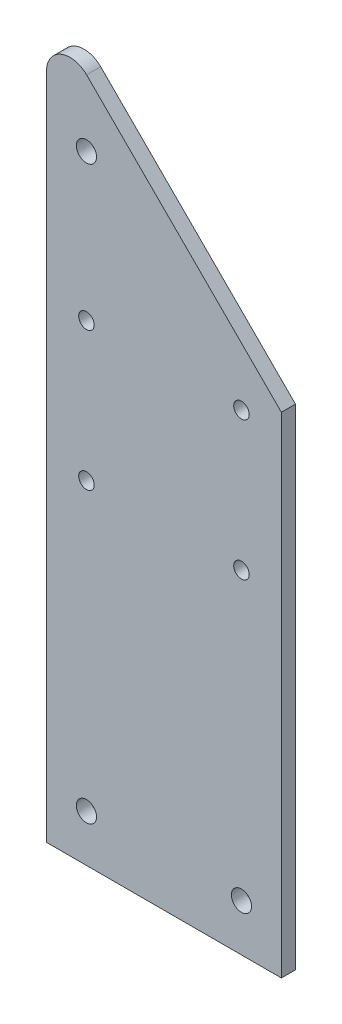
ISO-10303-21;
HEADER;
FILE_DESCRIPTION(('STEP AP214'),'2;1');
FILE_NAME('part.step','',(''),(''),'','','');
FILE_SCHEMA(('AUTOMOTIVE_DESIGN { 1 0 10303 214 1 1 1 1 }'));
ENDSEC;
DATA;
#1=APPLICATION_CONTEXT('core data for automotive mechanical design processes');
#2=APPLICATION_PROTOCOL_DEFINITION('international standard','automotive_design',2000,#1);
#3=PRODUCT_CONTEXT('',#1,'mechanical');
#4=PRODUCT('Part','Part','',(#3));
#5=PRODUCT_RELATED_PRODUCT_CATEGORY('part','',(#4));
#6=PRODUCT_DEFINITION_FORMATION('','',#4);
#7=PRODUCT_DEFINITION_CONTEXT('part definition',#1,'design');
#8=PRODUCT_DEFINITION('design','',#6,#7);
#9=PRODUCT_DEFINITION_SHAPE('','',#8);
#10=(LENGTH_UNIT() NAMED_UNIT(*) SI_UNIT(.MILLI.,.METRE.));
#11=(NAMED_UNIT(*) PLANE_ANGLE_UNIT() SI_UNIT($,.RADIAN.));
#12=(NAMED_UNIT(*) SI_UNIT($,.STERADIAN.) SOLID_ANGLE_UNIT());
#13=UNCERTAINTY_MEASURE_WITH_UNIT(LENGTH_MEASURE(1.E-05),#10,'distance_accuracy_value','');
#14=(GEOMETRIC_REPRESENTATION_CONTEXT(3) GLOBAL_UNCERTAINTY_ASSIGNED_CONTEXT((#13)) GLOBAL_UNIT_ASSIGNED_CONTEXT((#10,
#11,#12)) REPRESENTATION_CONTEXT('',''));
#15=CARTESIAN_POINT('',(0.,0.,0.));
#16=DIRECTION('',(0.,0.,1.));
#17=DIRECTION('',(1.,0.,0.));
#18=AXIS2_PLACEMENT_3D('',#15,#16,#17);
#19=CARTESIAN_POINT('',(50.,0.,3.));
#20=DIRECTION('',(0.,1.,0.));
#21=DIRECTION('',(-1.,0.,0.));
#22=AXIS2_PLACEMENT_3D('',#19,#20,#21);
#23=PLANE('',#22);
#24=DIRECTION('',(1.,0.,0.));
#25=VECTOR('',#24,1.);
#26=CARTESIAN_POINT('',(50.,0.,0.));
#27=LINE('',#26,#25);
#28=CARTESIAN_POINT('',(0.,0.,0.));
#29=VERTEX_POINT('',#28);
#30=CARTESIAN_POINT('',(50.,0.,0.));
#31=VERTEX_POINT('',#30);
#32=EDGE_CURVE('E103',#29,#31,#27,.T.);
#33=ORIENTED_EDGE('',*,*,#32,.T.);
#34=DIRECTION('',(0.,0.,-1.));
#35=VECTOR('',#34,1.);
#36=CARTESIAN_POINT('',(50.,0.,3.));
#37=LINE('',#36,#35);
#38=CARTESIAN_POINT('',(50.,0.,3.));
#39=VERTEX_POINT('',#38);
#40=EDGE_CURVE('E85',#39,#31,#37,.T.);
#41=ORIENTED_EDGE('',*,*,#40,.F.);
#42=DIRECTION('',(1.,0.,0.));
#43=VECTOR('',#42,1.);
#44=CARTESIAN_POINT('',(50.,0.,3.));
#45=LINE('',#44,#43);
#46=CARTESIAN_POINT('',(0.,0.,3.));
#47=VERTEX_POINT('',#46);
#48=EDGE_CURVE('E91',#47,#39,#45,.T.);
#49=ORIENTED_EDGE('',*,*,#48,.F.);
#50=DIRECTION('',(0.,0.,-1.));
#51=VECTOR('',#50,1.);
#52=CARTESIAN_POINT('',(0.,0.,3.));
#53=LINE('',#52,#51);
#54=EDGE_CURVE('E108',#47,#29,#53,.T.);
#55=ORIENTED_EDGE('',*,*,#54,.T.);
#56=EDGE_LOOP('',(#33,#41,#49,#55));
#57=FACE_BOUND('',#56,.T.);
#58=ADVANCED_FACE('F34',(#57),#23,.F.);
#59=CARTESIAN_POINT('',(50.,104.3,3.));
#60=DIRECTION('',(-1.,0.,0.));
#61=DIRECTION('',(0.,-1.,0.));
#62=AXIS2_PLACEMENT_3D('',#59,#60,#61);
#63=PLANE('',#62);
#64=DIRECTION('',(0.,1.,0.));
#65=VECTOR('',#64,1.);
#66=CARTESIAN_POINT('',(50.,104.3,0.));
#67=LINE('',#66,#65);
#68=CARTESIAN_POINT('',(50.,104.3,0.));
#69=VERTEX_POINT('',#68);
#70=EDGE_CURVE('E116',#31,#69,#67,.T.);
#71=ORIENTED_EDGE('',*,*,#70,.T.);
#72=DIRECTION('',(0.,0.,-1.));
#73=VECTOR('',#72,1.);
#74=CARTESIAN_POINT('',(50.,104.3,3.));
#75=LINE('',#74,#73);
#76=CARTESIAN_POINT('',(50.,104.3,3.));
#77=VERTEX_POINT('',#76);
#78=EDGE_CURVE('E88',#77,#69,#75,.T.);
#79=ORIENTED_EDGE('',*,*,#78,.F.);
#80=DIRECTION('',(0.,1.,0.));
#81=VECTOR('',#80,1.);
#82=CARTESIAN_POINT('',(50.,104.3,3.));
#83=LINE('',#82,#81);
#84=EDGE_CURVE('E81',#39,#77,#83,.T.);
#85=ORIENTED_EDGE('',*,*,#84,.F.);
#86=ORIENTED_EDGE('',*,*,#40,.T.);
#87=EDGE_LOOP('',(#71,#79,#85,#86));
#88=FACE_BOUND('',#87,.T.);
#89=ADVANCED_FACE('F83',(#88),#63,.F.);
#90=CARTESIAN_POINT('',(0.,154.299999999999,3.));
#91=DIRECTION('',(-0.707106781186541,-0.707106781186554,0.));
#92=DIRECTION('',(0.707106781186554,-0.707106781186541,0.));
#93=AXIS2_PLACEMENT_3D('',#90,#91,#92);
#94=PLANE('',#93);
#95=DIRECTION('',(-0.707106781186554,0.707106781186541,0.));
#96=VECTOR('',#95,1.);
#97=CARTESIAN_POINT('',(0.,154.299999999999,0.));
#98=LINE('',#97,#96);
#99=CARTESIAN_POINT('',(8.53553390593272,145.764466094067,0.));
#100=VERTEX_POINT('',#99);
#101=EDGE_CURVE('E114',#69,#100,#98,.T.);
#102=ORIENTED_EDGE('',*,*,#101,.T.);
#103=DIRECTION('',(0.,0.,-1.));
#104=VECTOR('',#103,1.);
#105=CARTESIAN_POINT('',(8.53553390593272,145.764466094067,3.));
#106=LINE('',#105,#104);
#107=CARTESIAN_POINT('',(8.53553390593272,145.764466094067,3.));
#108=VERTEX_POINT('',#107);
#109=EDGE_CURVE('E42',#100,#108,#106,.F.);
#110=ORIENTED_EDGE('',*,*,#109,.T.);
#111=DIRECTION('',(-0.707106781186554,0.707106781186541,0.));
#112=VECTOR('',#111,1.);
#113=CARTESIAN_POINT('',(0.,154.299999999999,3.));
#114=LINE('',#113,#112);
#115=EDGE_CURVE('E90',#77,#108,#114,.T.);
#116=ORIENTED_EDGE('',*,*,#115,.F.);
#117=ORIENTED_EDGE('',*,*,#78,.T.);
#118=EDGE_LOOP('',(#102,#110,#116,#117));
#119=FACE_BOUND('',#118,.T.);
#120=ADVANCED_FACE('F202',(#119),#94,.F.);
#121=CARTESIAN_POINT('',(0.,0.,3.));
#122=DIRECTION('',(1.,0.,0.));
#123=DIRECTION('',(0.,0.,-1.));
#124=AXIS2_PLACEMENT_3D('',#121,#122,#123);
#125=PLANE('',#124);
#126=DIRECTION('',(0.,-1.,0.));
#127=VECTOR('',#126,1.);
#128=CARTESIAN_POINT('',(0.,0.,3.));
#129=LINE('',#128,#127);
#130=CARTESIAN_POINT('',(0.,142.228932188134,3.));
#131=VERTEX_POINT('',#130);
#132=EDGE_CURVE('E96',#131,#47,#129,.T.);
#133=ORIENTED_EDGE('',*,*,#132,.F.);
#134=DIRECTION('',(0.,0.,-1.));
#135=VECTOR('',#134,1.);
#136=CARTESIAN_POINT('',(0.,142.228932188134,3.));
#137=LINE('',#136,#135);
#138=CARTESIAN_POINT('',(0.,142.228932188134,0.));
#139=VERTEX_POINT('',#138);
#140=EDGE_CURVE('E104',#131,#139,#137,.T.);
#141=ORIENTED_EDGE('',*,*,#140,.T.);
#142=DIRECTION('',(0.,-1.,0.));
#143=VECTOR('',#142,1.);
#144=CARTESIAN_POINT('',(0.,0.,0.));
#145=LINE('',#144,#143);
#146=EDGE_CURVE('E100',#139,#29,#145,.T.);
#147=ORIENTED_EDGE('',*,*,#146,.T.);
#148=ORIENTED_EDGE('',*,*,#54,.F.);
#149=EDGE_LOOP('',(#133,#141,#147,#148));
#150=FACE_BOUND('',#149,.T.);
#151=ADVANCED_FACE('F177',(#150),#125,.F.);
#152=CARTESIAN_POINT('',(0.,0.,3.));
#153=DIRECTION('',(0.,0.,-1.));
#154=DIRECTION('',(-1.,0.,0.));
#155=AXIS2_PLACEMENT_3D('',#152,#153,#154);
#156=PLANE('',#155);
#157=CARTESIAN_POINT('',(8.5,70.95,3.));
#158=DIRECTION('',(0.,0.,1.));
#159=DIRECTION('',(1.,0.,0.));
#160=AXIS2_PLACEMENT_3D('',#157,#158,#159);
#161=CIRCLE('',#160,1.65);
#162=CARTESIAN_POINT('',(10.15,70.95,3.));
#163=VERTEX_POINT('',#162);
#164=EDGE_CURVE('E140',#163,#163,#161,.T.);
#165=ORIENTED_EDGE('',*,*,#164,.F.);
#166=EDGE_LOOP('',(#165));
#167=FACE_BOUND('',#166,.T.);
#168=CARTESIAN_POINT('',(8.5,100.45,3.));
#169=DIRECTION('',(0.,0.,1.));
#170=DIRECTION('',(1.,0.,0.));
#171=AXIS2_PLACEMENT_3D('',#168,#169,#170);
#172=CIRCLE('',#171,1.65);
#173=CARTESIAN_POINT('',(10.15,100.45,3.));
#174=VERTEX_POINT('',#173);
#175=EDGE_CURVE('E147',#174,#174,#172,.T.);
#176=ORIENTED_EDGE('',*,*,#175,.F.);
#177=EDGE_LOOP('',(#176));
#178=FACE_BOUND('',#177,.T.);
#179=CARTESIAN_POINT('',(8.5,131.657864376269,3.));
#180=DIRECTION('',(0.,0.,1.));
#181=DIRECTION('',(1.,0.,0.));
#182=AXIS2_PLACEMENT_3D('',#179,#180,#181);
#183=CIRCLE('',#182,2.15000000000002);
#184=CARTESIAN_POINT('',(10.65,131.657864376269,3.));
#185=VERTEX_POINT('',#184);
#186=EDGE_CURVE('E128',#185,#185,#183,.T.);
#187=ORIENTED_EDGE('',*,*,#186,.F.);
#188=EDGE_LOOP('',(#187));
#189=FACE_BOUND('',#188,.T.);
#190=CARTESIAN_POINT('',(41.5,10.,3.));
#191=DIRECTION('',(0.,0.,1.));
#192=DIRECTION('',(1.,0.,0.));
#193=AXIS2_PLACEMENT_3D('',#190,#191,#192);
#194=CIRCLE('',#193,2.15);
#195=CARTESIAN_POINT('',(43.65,10.,3.));
#196=VERTEX_POINT('',#195);
#197=EDGE_CURVE('E135',#196,#196,#194,.T.);
#198=ORIENTED_EDGE('',*,*,#197,.F.);
#199=EDGE_LOOP('',(#198));
#200=FACE_BOUND('',#199,.T.);
#201=CARTESIAN_POINT('',(41.5,70.95,3.));
#202=DIRECTION('',(0.,0.,1.));
#203=DIRECTION('',(1.,0.,0.));
#204=AXIS2_PLACEMENT_3D('',#201,#202,#203);
#205=CIRCLE('',#204,1.65);
#206=CARTESIAN_POINT('',(43.15,70.95,3.));
#207=VERTEX_POINT('',#206);
#208=EDGE_CURVE('E158',#207,#207,#205,.T.);
#209=ORIENTED_EDGE('',*,*,#208,.F.);
#210=EDGE_LOOP('',(#209));
#211=FACE_BOUND('',#210,.T.);
#212=CARTESIAN_POINT('',(41.5,100.45,3.));
#213=DIRECTION('',(0.,0.,1.));
#214=DIRECTION('',(1.,0.,0.));
#215=AXIS2_PLACEMENT_3D('',#212,#213,#214);
#216=CIRCLE('',#215,1.65);
#217=CARTESIAN_POINT('',(43.15,100.45,3.));
#218=VERTEX_POINT('',#217);
#219=EDGE_CURVE('E152',#218,#218,#216,.T.);
#220=ORIENTED_EDGE('',*,*,#219,.F.);
#221=EDGE_LOOP('',(#220));
#222=FACE_BOUND('',#221,.T.);
#223=CARTESIAN_POINT('',(8.5,10.,3.));
#224=DIRECTION('',(0.,0.,1.));
#225=DIRECTION('',(1.,0.,0.));
#226=AXIS2_PLACEMENT_3D('',#223,#224,#225);
#227=CIRCLE('',#226,2.15);
#228=CARTESIAN_POINT('',(10.65,10.,3.));
#229=VERTEX_POINT('',#228);
#230=EDGE_CURVE('E122',#229,#229,#227,.T.);
#231=ORIENTED_EDGE('',*,*,#230,.F.);
#232=EDGE_LOOP('',(#231));
#233=FACE_BOUND('',#232,.T.);
#234=ORIENTED_EDGE('',*,*,#115,.T.);
#235=CARTESIAN_POINT('',(5.,142.228932188134,3.));
#236=DIRECTION('',(0.,0.,-1.));
#237=DIRECTION('',(-1.,0.,0.));
#238=AXIS2_PLACEMENT_3D('',#235,#236,#237);
#239=CIRCLE('',#238,5.);
#240=EDGE_CURVE('E11',#108,#131,#239,.F.);
#241=ORIENTED_EDGE('',*,*,#240,.T.);
#242=ORIENTED_EDGE('',*,*,#132,.T.);
#243=ORIENTED_EDGE('',*,*,#48,.T.);
#244=ORIENTED_EDGE('',*,*,#84,.T.);
#245=EDGE_LOOP('',(#234,#241,#242,#243,#244));
#246=FACE_BOUND('',#245,.T.);
#247=ADVANCED_FACE('F94',(#167,#178,#189,#200,#211,#222,#233,#246),#156,.F.);
#248=CARTESIAN_POINT('',(0.,0.,0.));
#249=DIRECTION('',(0.,0.,-1.));
#250=DIRECTION('',(-1.,0.,0.));
#251=AXIS2_PLACEMENT_3D('',#248,#249,#250);
#252=PLANE('',#251);
#253=CARTESIAN_POINT('',(8.5,70.95,0.));
#254=DIRECTION('',(0.,0.,1.));
#255=DIRECTION('',(1.,0.,0.));
#256=AXIS2_PLACEMENT_3D('',#253,#254,#255);
#257=CIRCLE('',#256,1.65);
#258=CARTESIAN_POINT('',(10.15,70.95,0.));
#259=VERTEX_POINT('',#258);
#260=EDGE_CURVE('E143',#259,#259,#257,.T.);
#261=ORIENTED_EDGE('',*,*,#260,.T.);
#262=EDGE_LOOP('',(#261));
#263=FACE_BOUND('',#262,.T.);
#264=CARTESIAN_POINT('',(8.5,100.45,0.));
#265=DIRECTION('',(0.,0.,1.));
#266=DIRECTION('',(1.,0.,0.));
#267=AXIS2_PLACEMENT_3D('',#264,#265,#266);
#268=CIRCLE('',#267,1.65);
#269=CARTESIAN_POINT('',(10.15,100.45,0.));
#270=VERTEX_POINT('',#269);
#271=EDGE_CURVE('E132',#270,#270,#268,.T.);
#272=ORIENTED_EDGE('',*,*,#271,.T.);
#273=EDGE_LOOP('',(#272));
#274=FACE_BOUND('',#273,.T.);
#275=CARTESIAN_POINT('',(8.5,131.657864376269,0.));
#276=DIRECTION('',(0.,0.,1.));
#277=DIRECTION('',(1.,0.,0.));
#278=AXIS2_PLACEMENT_3D('',#275,#276,#277);
#279=CIRCLE('',#278,2.15000000000002);
#280=CARTESIAN_POINT('',(10.65,131.657864376269,0.));
#281=VERTEX_POINT('',#280);
#282=EDGE_CURVE('E131',#281,#281,#279,.T.);
#283=ORIENTED_EDGE('',*,*,#282,.T.);
#284=EDGE_LOOP('',(#283));
#285=FACE_BOUND('',#284,.T.);
#286=CARTESIAN_POINT('',(41.5,10.,0.));
#287=DIRECTION('',(0.,0.,1.));
#288=DIRECTION('',(1.,0.,0.));
#289=AXIS2_PLACEMENT_3D('',#286,#287,#288);
#290=CIRCLE('',#289,2.15);
#291=CARTESIAN_POINT('',(43.65,10.,0.));
#292=VERTEX_POINT('',#291);
#293=EDGE_CURVE('E125',#292,#292,#290,.T.);
#294=ORIENTED_EDGE('',*,*,#293,.T.);
#295=EDGE_LOOP('',(#294));
#296=FACE_BOUND('',#295,.T.);
#297=CARTESIAN_POINT('',(41.5,70.95,0.));
#298=DIRECTION('',(0.,0.,1.));
#299=DIRECTION('',(1.,0.,0.));
#300=AXIS2_PLACEMENT_3D('',#297,#298,#299);
#301=CIRCLE('',#300,1.65);
#302=CARTESIAN_POINT('',(43.15,70.95,0.));
#303=VERTEX_POINT('',#302);
#304=EDGE_CURVE('E144',#303,#303,#301,.T.);
#305=ORIENTED_EDGE('',*,*,#304,.T.);
#306=EDGE_LOOP('',(#305));
#307=FACE_BOUND('',#306,.T.);
#308=CARTESIAN_POINT('',(41.5,100.45,0.));
#309=DIRECTION('',(0.,0.,1.));
#310=DIRECTION('',(1.,0.,0.));
#311=AXIS2_PLACEMENT_3D('',#308,#309,#310);
#312=CIRCLE('',#311,1.65);
#313=CARTESIAN_POINT('',(43.15,100.45,0.));
#314=VERTEX_POINT('',#313);
#315=EDGE_CURVE('E155',#314,#314,#312,.T.);
#316=ORIENTED_EDGE('',*,*,#315,.T.);
#317=EDGE_LOOP('',(#316));
#318=FACE_BOUND('',#317,.T.);
#319=CARTESIAN_POINT('',(8.5,10.,0.));
#320=DIRECTION('',(0.,0.,1.));
#321=DIRECTION('',(1.,0.,0.));
#322=AXIS2_PLACEMENT_3D('',#319,#320,#321);
#323=CIRCLE('',#322,2.15);
#324=CARTESIAN_POINT('',(10.65,10.,0.));
#325=VERTEX_POINT('',#324);
#326=EDGE_CURVE('E119',#325,#325,#323,.T.);
#327=ORIENTED_EDGE('',*,*,#326,.T.);
#328=EDGE_LOOP('',(#327));
#329=FACE_BOUND('',#328,.T.);
#330=ORIENTED_EDGE('',*,*,#146,.F.);
#331=CARTESIAN_POINT('',(5.,142.228932188134,0.));
#332=DIRECTION('',(0.,0.,-1.));
#333=DIRECTION('',(-1.,0.,0.));
#334=AXIS2_PLACEMENT_3D('',#331,#332,#333);
#335=CIRCLE('',#334,5.);
#336=EDGE_CURVE('E56',#139,#100,#335,.T.);
#337=ORIENTED_EDGE('',*,*,#336,.T.);
#338=ORIENTED_EDGE('',*,*,#101,.F.);
#339=ORIENTED_EDGE('',*,*,#70,.F.);
#340=ORIENTED_EDGE('',*,*,#32,.F.);
#341=EDGE_LOOP('',(#330,#337,#338,#339,#340));
#342=FACE_BOUND('',#341,.T.);
#343=ADVANCED_FACE('F164',(#263,#274,#285,#296,#307,#318,#329,#342),#252,.T.);
#344=CARTESIAN_POINT('',(8.5,10.,0.));
#345=DIRECTION('',(0.,0.,1.));
#346=DIRECTION('',(1.,0.,0.));
#347=AXIS2_PLACEMENT_3D('',#344,#345,#346);
#348=CYLINDRICAL_SURFACE('',#347,2.15);
#349=ORIENTED_EDGE('',*,*,#326,.F.);
#350=EDGE_LOOP('',(#349));
#351=FACE_BOUND('',#350,.T.);
#352=ORIENTED_EDGE('',*,*,#230,.T.);
#353=EDGE_LOOP('',(#352));
#354=FACE_BOUND('',#353,.T.);
#355=ADVANCED_FACE('F184',(#351,#354),#348,.F.);
#356=CARTESIAN_POINT('',(41.5,100.45,0.));
#357=DIRECTION('',(0.,0.,1.));
#358=DIRECTION('',(1.,0.,0.));
#359=AXIS2_PLACEMENT_3D('',#356,#357,#358);
#360=CYLINDRICAL_SURFACE('',#359,1.65);
#361=ORIENTED_EDGE('',*,*,#315,.F.);
#362=EDGE_LOOP('',(#361));
#363=FACE_BOUND('',#362,.T.);
#364=ORIENTED_EDGE('',*,*,#219,.T.);
#365=EDGE_LOOP('',(#364));
#366=FACE_BOUND('',#365,.T.);
#367=ADVANCED_FACE('F171',(#363,#366),#360,.F.);
#368=CARTESIAN_POINT('',(41.5,70.95,0.));
#369=DIRECTION('',(0.,0.,1.));
#370=DIRECTION('',(1.,0.,0.));
#371=AXIS2_PLACEMENT_3D('',#368,#369,#370);
#372=CYLINDRICAL_SURFACE('',#371,1.65);
#373=ORIENTED_EDGE('',*,*,#304,.F.);
#374=EDGE_LOOP('',(#373));
#375=FACE_BOUND('',#374,.T.);
#376=ORIENTED_EDGE('',*,*,#208,.T.);
#377=EDGE_LOOP('',(#376));
#378=FACE_BOUND('',#377,.T.);
#379=ADVANCED_FACE('F167',(#375,#378),#372,.F.);
#380=CARTESIAN_POINT('',(41.5,10.,0.));
#381=DIRECTION('',(0.,0.,1.));
#382=DIRECTION('',(1.,0.,0.));
#383=AXIS2_PLACEMENT_3D('',#380,#381,#382);
#384=CYLINDRICAL_SURFACE('',#383,2.15);
#385=ORIENTED_EDGE('',*,*,#293,.F.);
#386=EDGE_LOOP('',(#385));
#387=FACE_BOUND('',#386,.T.);
#388=ORIENTED_EDGE('',*,*,#197,.T.);
#389=EDGE_LOOP('',(#388));
#390=FACE_BOUND('',#389,.T.);
#391=ADVANCED_FACE('F170',(#387,#390),#384,.F.);
#392=CARTESIAN_POINT('',(8.5,131.657864376269,0.));
#393=DIRECTION('',(0.,0.,1.));
#394=DIRECTION('',(1.,0.,0.));
#395=AXIS2_PLACEMENT_3D('',#392,#393,#394);
#396=CYLINDRICAL_SURFACE('',#395,2.15000000000002);
#397=ORIENTED_EDGE('',*,*,#282,.F.);
#398=EDGE_LOOP('',(#397));
#399=FACE_BOUND('',#398,.T.);
#400=ORIENTED_EDGE('',*,*,#186,.T.);
#401=EDGE_LOOP('',(#400));
#402=FACE_BOUND('',#401,.T.);
#403=ADVANCED_FACE('F225',(#399,#402),#396,.F.);
#404=CARTESIAN_POINT('',(8.5,100.45,0.));
#405=DIRECTION('',(0.,0.,1.));
#406=DIRECTION('',(1.,0.,0.));
#407=AXIS2_PLACEMENT_3D('',#404,#405,#406);
#408=CYLINDRICAL_SURFACE('',#407,1.65);
#409=ORIENTED_EDGE('',*,*,#271,.F.);
#410=EDGE_LOOP('',(#409));
#411=FACE_BOUND('',#410,.T.);
#412=ORIENTED_EDGE('',*,*,#175,.T.);
#413=EDGE_LOOP('',(#412));
#414=FACE_BOUND('',#413,.T.);
#415=ADVANCED_FACE('F219',(#411,#414),#408,.F.);
#416=CARTESIAN_POINT('',(8.5,70.95,0.));
#417=DIRECTION('',(0.,0.,1.));
#418=DIRECTION('',(1.,0.,0.));
#419=AXIS2_PLACEMENT_3D('',#416,#417,#418);
#420=CYLINDRICAL_SURFACE('',#419,1.65);
#421=ORIENTED_EDGE('',*,*,#260,.F.);
#422=EDGE_LOOP('',(#421));
#423=FACE_BOUND('',#422,.T.);
#424=ORIENTED_EDGE('',*,*,#164,.T.);
#425=EDGE_LOOP('',(#424));
#426=FACE_BOUND('',#425,.T.);
#427=ADVANCED_FACE('F215',(#423,#426),#420,.F.);
#428=CARTESIAN_POINT('',(5.,142.228932188134,3.));
#429=DIRECTION('',(0.,0.,-1.));
#430=DIRECTION('',(-1.,0.,0.));
#431=AXIS2_PLACEMENT_3D('',#428,#429,#430);
#432=CYLINDRICAL_SURFACE('',#431,5.);
#433=ORIENTED_EDGE('',*,*,#240,.F.);
#434=ORIENTED_EDGE('',*,*,#109,.F.);
#435=ORIENTED_EDGE('',*,*,#336,.F.);
#436=ORIENTED_EDGE('',*,*,#140,.F.);
#437=EDGE_LOOP('',(#433,#434,#435,#436));
#438=FACE_BOUND('',#437,.T.);
#439=ADVANCED_FACE('F36',(#438),#432,.T.);
#440=CLOSED_SHELL('',(#58,#89,#120,#151,#247,#343,#355,#367,#379,#391,#403,#415,#427,#439));
#441=MANIFOLD_SOLID_BREP('B2',#440);
#442=ADVANCED_BREP_SHAPE_REPRESENTATION('',(#18,#441),#14);
#443=SHAPE_DEFINITION_REPRESENTATION(#9,#442);
ENDSEC;
END-ISO-10303-21;
